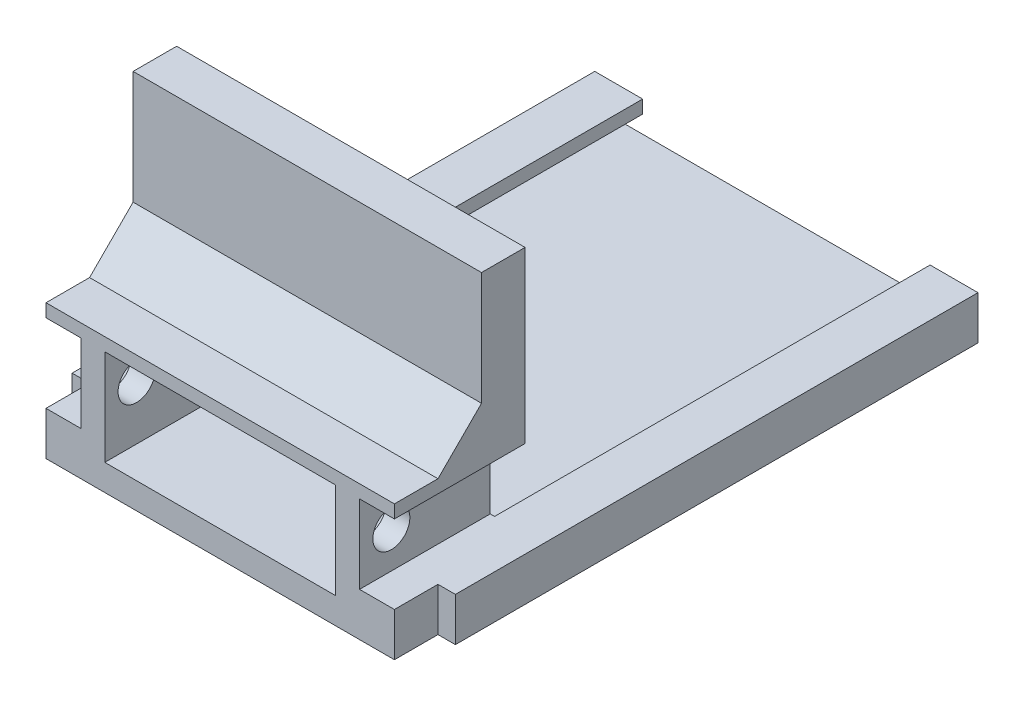
ISO-10303-21;
HEADER;
FILE_DESCRIPTION(('STEP AP214'),'2;1');
FILE_NAME('part.step','',(''),(''),'','','');
FILE_SCHEMA(('AUTOMOTIVE_DESIGN { 1 0 10303 214 1 1 1 1 }'));
ENDSEC;
DATA;
#1=APPLICATION_CONTEXT('core data for automotive mechanical design processes');
#2=APPLICATION_PROTOCOL_DEFINITION('international standard','automotive_design',2000,#1);
#3=PRODUCT_CONTEXT('',#1,'mechanical');
#4=PRODUCT('Part','Part','',(#3));
#5=PRODUCT_RELATED_PRODUCT_CATEGORY('part','',(#4));
#6=PRODUCT_DEFINITION_FORMATION('','',#4);
#7=PRODUCT_DEFINITION_CONTEXT('part definition',#1,'design');
#8=PRODUCT_DEFINITION('design','',#6,#7);
#9=PRODUCT_DEFINITION_SHAPE('','',#8);
#10=(LENGTH_UNIT() NAMED_UNIT(*) SI_UNIT(.MILLI.,.METRE.));
#11=(NAMED_UNIT(*) PLANE_ANGLE_UNIT() SI_UNIT($,.RADIAN.));
#12=(NAMED_UNIT(*) SI_UNIT($,.STERADIAN.) SOLID_ANGLE_UNIT());
#13=UNCERTAINTY_MEASURE_WITH_UNIT(LENGTH_MEASURE(1.E-05),#10,'distance_accuracy_value','');
#14=(GEOMETRIC_REPRESENTATION_CONTEXT(3) GLOBAL_UNCERTAINTY_ASSIGNED_CONTEXT((#13)) GLOBAL_UNIT_ASSIGNED_CONTEXT((#10,
#11,#12)) REPRESENTATION_CONTEXT('',''));
#15=CARTESIAN_POINT('',(0.,0.,0.));
#16=DIRECTION('',(0.,0.,1.));
#17=DIRECTION('',(1.,0.,0.));
#18=AXIS2_PLACEMENT_3D('',#15,#16,#17);
#19=CARTESIAN_POINT('',(3.99999999999999,0.,120.));
#20=DIRECTION('',(-1.,0.,0.));
#21=DIRECTION('',(0.,-1.,0.));
#22=AXIS2_PLACEMENT_3D('',#19,#20,#21);
#23=PLANE('',#22);
#24=DIRECTION('',(0.,-1.,0.));
#25=VECTOR('',#24,1.);
#26=CARTESIAN_POINT('',(3.99999999999999,57.,110.));
#27=LINE('',#26,#25);
#28=CARTESIAN_POINT('',(3.99999999999999,57.,110.));
#29=VERTEX_POINT('',#28);
#30=CARTESIAN_POINT('',(3.99999999999999,31.,110.));
#31=VERTEX_POINT('',#30);
#32=EDGE_CURVE('E246',#29,#31,#27,.T.);
#33=ORIENTED_EDGE('',*,*,#32,.F.);
#34=DIRECTION('',(0.,0.,-1.));
#35=VECTOR('',#34,1.);
#36=CARTESIAN_POINT('',(3.99999999999999,57.,120.));
#37=LINE('',#36,#35);
#38=CARTESIAN_POINT('',(3.99999999999999,57.,100.));
#39=VERTEX_POINT('',#38);
#40=EDGE_CURVE('E254',#29,#39,#37,.T.);
#41=ORIENTED_EDGE('',*,*,#40,.T.);
#42=DIRECTION('',(0.,1.,0.));
#43=VECTOR('',#42,1.);
#44=CARTESIAN_POINT('',(3.99999999999999,0.,100.));
#45=LINE('',#44,#43);
#46=CARTESIAN_POINT('',(3.99999999999999,18.,100.));
#47=VERTEX_POINT('',#46);
#48=EDGE_CURVE('E474',#47,#39,#45,.T.);
#49=ORIENTED_EDGE('',*,*,#48,.F.);
#50=DIRECTION('',(0.,0.,1.));
#51=VECTOR('',#50,1.);
#52=CARTESIAN_POINT('',(3.99999999999999,18.,42.6153330583857));
#53=LINE('',#52,#51);
#54=CARTESIAN_POINT('',(3.99999999999999,18.,130.));
#55=VERTEX_POINT('',#54);
#56=EDGE_CURVE('E489',#47,#55,#53,.T.);
#57=ORIENTED_EDGE('',*,*,#56,.T.);
#58=DIRECTION('',(0.,-1.,0.));
#59=VECTOR('',#58,1.);
#60=CARTESIAN_POINT('',(3.99999999999999,-10.,130.));
#61=LINE('',#60,#59);
#62=CARTESIAN_POINT('',(3.99999999999999,21.,130.));
#63=VERTEX_POINT('',#62);
#64=EDGE_CURVE('E491',#63,#55,#61,.T.);
#65=ORIENTED_EDGE('',*,*,#64,.F.);
#66=DIRECTION('',(0.,0.,-1.));
#67=VECTOR('',#66,1.);
#68=CARTESIAN_POINT('',(3.99999999999999,21.,130.));
#69=LINE('',#68,#67);
#70=CARTESIAN_POINT('',(3.99999999999999,21.,120.));
#71=VERTEX_POINT('',#70);
#72=EDGE_CURVE('E523',#63,#71,#69,.T.);
#73=ORIENTED_EDGE('',*,*,#72,.T.);
#74=DIRECTION('',(0.,-0.707106781186544,0.707106781186551));
#75=VECTOR('',#74,1.);
#76=CARTESIAN_POINT('',(3.99999999999999,21.,120.));
#77=LINE('',#76,#75);
#78=EDGE_CURVE('E52',#71,#31,#77,.F.);
#79=ORIENTED_EDGE('',*,*,#78,.T.);
#80=EDGE_LOOP('',(#33,#41,#49,#57,#65,#73,#79));
#81=FACE_BOUND('',#80,.T.);
#82=ADVANCED_FACE('F42',(#81),#23,.T.);
#83=CARTESIAN_POINT('',(84.,0.,120.));
#84=DIRECTION('',(-1.,0.,0.));
#85=DIRECTION('',(0.,-1.,0.));
#86=AXIS2_PLACEMENT_3D('',#83,#84,#85);
#87=PLANE('',#86);
#88=DIRECTION('',(0.,1.,0.));
#89=VECTOR('',#88,1.);
#90=CARTESIAN_POINT('',(84.,-10.,120.));
#91=LINE('',#90,#89);
#92=CARTESIAN_POINT('',(84.,-10.,120.));
#93=VERTEX_POINT('',#92);
#94=CARTESIAN_POINT('',(84.,0.,120.));
#95=VERTEX_POINT('',#94);
#96=EDGE_CURVE('E514',#93,#95,#91,.T.);
#97=ORIENTED_EDGE('',*,*,#96,.T.);
#98=DIRECTION('',(0.,0.,1.));
#99=VECTOR('',#98,1.);
#100=CARTESIAN_POINT('',(84.,0.,42.6153330583857));
#101=LINE('',#100,#99);
#102=CARTESIAN_POINT('',(84.,0.,130.));
#103=VERTEX_POINT('',#102);
#104=EDGE_CURVE('E566',#95,#103,#101,.T.);
#105=ORIENTED_EDGE('',*,*,#104,.T.);
#106=DIRECTION('',(0.,1.,0.));
#107=VECTOR('',#106,1.);
#108=CARTESIAN_POINT('',(84.,-10.,130.));
#109=LINE('',#108,#107);
#110=CARTESIAN_POINT('',(84.,-10.,130.));
#111=VERTEX_POINT('',#110);
#112=EDGE_CURVE('E519',#111,#103,#109,.T.);
#113=ORIENTED_EDGE('',*,*,#112,.F.);
#114=DIRECTION('',(0.,0.,-1.));
#115=VECTOR('',#114,1.);
#116=CARTESIAN_POINT('',(84.,-10.,130.));
#117=LINE('',#116,#115);
#118=EDGE_CURVE('E534',#111,#93,#117,.T.);
#119=ORIENTED_EDGE('',*,*,#118,.T.);
#120=EDGE_LOOP('',(#97,#105,#113,#119));
#121=FACE_BOUND('',#120,.T.);
#122=ADVANCED_FACE('F664',(#121),#87,.F.);
#123=CARTESIAN_POINT('',(0.,0.,120.));
#124=DIRECTION('',(0.,0.,1.));
#125=DIRECTION('',(1.,0.,0.));
#126=AXIS2_PLACEMENT_3D('',#123,#124,#125);
#127=PLANE('',#126);
#128=DIRECTION('',(0.,-1.,0.));
#129=VECTOR('',#128,1.);
#130=CARTESIAN_POINT('',(3.99999999999999,-10.,120.));
#131=LINE('',#130,#129);
#132=CARTESIAN_POINT('',(3.99999999999999,0.,120.));
#133=VERTEX_POINT('',#132);
#134=CARTESIAN_POINT('',(3.99999999999999,-10.,120.));
#135=VERTEX_POINT('',#134);
#136=EDGE_CURVE('E378',#133,#135,#131,.T.);
#137=ORIENTED_EDGE('',*,*,#136,.F.);
#138=DIRECTION('',(-1.,0.,0.));
#139=VECTOR('',#138,1.);
#140=CARTESIAN_POINT('',(0.,0.,120.));
#141=LINE('',#140,#139);
#142=CARTESIAN_POINT('',(0.,0.,120.));
#143=VERTEX_POINT('',#142);
#144=EDGE_CURVE('E461',#133,#143,#141,.T.);
#145=ORIENTED_EDGE('',*,*,#144,.T.);
#146=DIRECTION('',(0.,-1.,0.));
#147=VECTOR('',#146,1.);
#148=CARTESIAN_POINT('',(0.,0.,120.));
#149=LINE('',#148,#147);
#150=CARTESIAN_POINT('',(0.,-10.,120.));
#151=VERTEX_POINT('',#150);
#152=EDGE_CURVE('E455',#143,#151,#149,.T.);
#153=ORIENTED_EDGE('',*,*,#152,.T.);
#154=DIRECTION('',(1.,0.,0.));
#155=VECTOR('',#154,1.);
#156=CARTESIAN_POINT('',(0.,-10.,120.));
#157=LINE('',#156,#155);
#158=EDGE_CURVE('E450',#151,#135,#157,.T.);
#159=ORIENTED_EDGE('',*,*,#158,.T.);
#160=EDGE_LOOP('',(#137,#145,#153,#159));
#161=FACE_BOUND('',#160,.T.);
#162=ADVANCED_FACE('F459',(#161),#127,.T.);
#163=CARTESIAN_POINT('',(0.,-3.,100.));
#164=DIRECTION('',(0.,1.,0.));
#165=DIRECTION('',(0.,0.,1.));
#166=AXIS2_PLACEMENT_3D('',#163,#164,#165);
#167=PLANE('',#166);
#168=DIRECTION('',(1.,0.,0.));
#169=VECTOR('',#168,1.);
#170=CARTESIAN_POINT('',(0.,-3.,0.));
#171=LINE('',#170,#169);
#172=CARTESIAN_POINT('',(77.,-3.,0.));
#173=VERTEX_POINT('',#172);
#174=CARTESIAN_POINT('',(85.,-3.,0.));
#175=VERTEX_POINT('',#174);
#176=EDGE_CURVE('E269',#173,#175,#171,.T.);
#177=ORIENTED_EDGE('',*,*,#176,.T.);
#178=DIRECTION('',(0.,0.,-1.));
#179=VECTOR('',#178,1.);
#180=CARTESIAN_POINT('',(85.,-3.,100.));
#181=LINE('',#180,#179);
#182=CARTESIAN_POINT('',(85.,-3.,100.));
#183=VERTEX_POINT('',#182);
#184=EDGE_CURVE('E374',#183,#175,#181,.T.);
#185=ORIENTED_EDGE('',*,*,#184,.F.);
#186=DIRECTION('',(1.,0.,0.));
#187=VECTOR('',#186,1.);
#188=CARTESIAN_POINT('',(0.,-3.,100.));
#189=LINE('',#188,#187);
#190=CARTESIAN_POINT('',(77.,-3.,100.));
#191=VERTEX_POINT('',#190);
#192=EDGE_CURVE('E277',#191,#183,#189,.T.);
#193=ORIENTED_EDGE('',*,*,#192,.F.);
#194=DIRECTION('',(0.,0.,-1.));
#195=VECTOR('',#194,1.);
#196=CARTESIAN_POINT('',(77.,-3.,100.));
#197=LINE('',#196,#195);
#198=EDGE_CURVE('E301',#191,#173,#197,.T.);
#199=ORIENTED_EDGE('',*,*,#198,.T.);
#200=EDGE_LOOP('',(#177,#185,#193,#199));
#201=FACE_BOUND('',#200,.T.);
#202=ADVANCED_FACE('F428',(#201),#167,.F.);
#203=CARTESIAN_POINT('',(85.,0.,100.));
#204=DIRECTION('',(1.,0.,0.));
#205=DIRECTION('',(0.,0.,-1.));
#206=AXIS2_PLACEMENT_3D('',#203,#204,#205);
#207=PLANE('',#206);
#208=DIRECTION('',(0.,-1.,0.));
#209=VECTOR('',#208,1.);
#210=CARTESIAN_POINT('',(85.,0.,0.));
#211=LINE('',#210,#209);
#212=CARTESIAN_POINT('',(85.,-7.,0.));
#213=VERTEX_POINT('',#212);
#214=EDGE_CURVE('E305',#175,#213,#211,.T.);
#215=ORIENTED_EDGE('',*,*,#214,.T.);
#216=DIRECTION('',(0.,0.,-1.));
#217=VECTOR('',#216,1.);
#218=CARTESIAN_POINT('',(85.,-7.,100.));
#219=LINE('',#218,#217);
#220=CARTESIAN_POINT('',(85.,-7.,100.));
#221=VERTEX_POINT('',#220);
#222=EDGE_CURVE('E371',#221,#213,#219,.T.);
#223=ORIENTED_EDGE('',*,*,#222,.F.);
#224=DIRECTION('',(0.,-1.,0.));
#225=VECTOR('',#224,1.);
#226=CARTESIAN_POINT('',(85.,0.,100.));
#227=LINE('',#226,#225);
#228=EDGE_CURVE('E280',#183,#221,#227,.T.);
#229=ORIENTED_EDGE('',*,*,#228,.F.);
#230=ORIENTED_EDGE('',*,*,#184,.T.);
#231=EDGE_LOOP('',(#215,#223,#229,#230));
#232=FACE_BOUND('',#231,.T.);
#233=ADVANCED_FACE('F425',(#232),#207,.F.);
#234=CARTESIAN_POINT('',(0.,-7.,100.));
#235=DIRECTION('',(0.,1.,0.));
#236=DIRECTION('',(0.,0.,1.));
#237=AXIS2_PLACEMENT_3D('',#234,#235,#236);
#238=PLANE('',#237);
#239=DIRECTION('',(1.,0.,0.));
#240=VECTOR('',#239,1.);
#241=CARTESIAN_POINT('',(0.,-7.,0.));
#242=LINE('',#241,#240);
#243=CARTESIAN_POINT('',(3.,-7.,0.));
#244=VERTEX_POINT('',#243);
#245=EDGE_CURVE('E310',#244,#213,#242,.T.);
#246=ORIENTED_EDGE('',*,*,#245,.F.);
#247=DIRECTION('',(0.,0.,-1.));
#248=VECTOR('',#247,1.);
#249=CARTESIAN_POINT('',(3.,-7.,100.));
#250=LINE('',#249,#248);
#251=CARTESIAN_POINT('',(3.,-7.,100.));
#252=VERTEX_POINT('',#251);
#253=EDGE_CURVE('E368',#252,#244,#250,.T.);
#254=ORIENTED_EDGE('',*,*,#253,.F.);
#255=DIRECTION('',(1.,0.,0.));
#256=VECTOR('',#255,1.);
#257=CARTESIAN_POINT('',(0.,-7.,100.));
#258=LINE('',#257,#256);
#259=EDGE_CURVE('E286',#252,#221,#258,.T.);
#260=ORIENTED_EDGE('',*,*,#259,.T.);
#261=ORIENTED_EDGE('',*,*,#222,.T.);
#262=EDGE_LOOP('',(#246,#254,#260,#261));
#263=FACE_BOUND('',#262,.T.);
#264=ADVANCED_FACE('F421',(#263),#238,.T.);
#265=CARTESIAN_POINT('',(3.,0.,100.));
#266=DIRECTION('',(1.,0.,0.));
#267=DIRECTION('',(0.,1.,0.));
#268=AXIS2_PLACEMENT_3D('',#265,#266,#267);
#269=PLANE('',#268);
#270=DIRECTION('',(0.,-1.,0.));
#271=VECTOR('',#270,1.);
#272=CARTESIAN_POINT('',(3.,0.,0.));
#273=LINE('',#272,#271);
#274=CARTESIAN_POINT('',(3.,-3.,0.));
#275=VERTEX_POINT('',#274);
#276=EDGE_CURVE('E314',#275,#244,#273,.T.);
#277=ORIENTED_EDGE('',*,*,#276,.F.);
#278=DIRECTION('',(0.,0.,-1.));
#279=VECTOR('',#278,1.);
#280=CARTESIAN_POINT('',(3.,-3.,100.));
#281=LINE('',#280,#279);
#282=CARTESIAN_POINT('',(3.,-3.,100.));
#283=VERTEX_POINT('',#282);
#284=EDGE_CURVE('E365',#283,#275,#281,.T.);
#285=ORIENTED_EDGE('',*,*,#284,.F.);
#286=DIRECTION('',(0.,-1.,0.));
#287=VECTOR('',#286,1.);
#288=CARTESIAN_POINT('',(3.,0.,100.));
#289=LINE('',#288,#287);
#290=EDGE_CURVE('E289',#283,#252,#289,.T.);
#291=ORIENTED_EDGE('',*,*,#290,.T.);
#292=ORIENTED_EDGE('',*,*,#253,.T.);
#293=EDGE_LOOP('',(#277,#285,#291,#292));
#294=FACE_BOUND('',#293,.T.);
#295=ADVANCED_FACE('F418',(#294),#269,.T.);
#296=CARTESIAN_POINT('',(11.,-3.,0.));
#297=VERTEX_POINT('',#296);
#298=EDGE_CURVE('E306',#275,#297,#171,.T.);
#299=ORIENTED_EDGE('',*,*,#298,.T.);
#300=DIRECTION('',(0.,0.,-1.));
#301=VECTOR('',#300,1.);
#302=CARTESIAN_POINT('',(11.,-3.,100.));
#303=LINE('',#302,#301);
#304=CARTESIAN_POINT('',(11.,-3.,100.));
#305=VERTEX_POINT('',#304);
#306=EDGE_CURVE('E362',#305,#297,#303,.T.);
#307=ORIENTED_EDGE('',*,*,#306,.F.);
#308=EDGE_CURVE('E282',#283,#305,#189,.T.);
#309=ORIENTED_EDGE('',*,*,#308,.F.);
#310=ORIENTED_EDGE('',*,*,#284,.T.);
#311=EDGE_LOOP('',(#299,#307,#309,#310));
#312=FACE_BOUND('',#311,.T.);
#313=ADVANCED_FACE('F396',(#312),#167,.F.);
#314=CARTESIAN_POINT('',(11.,0.,100.));
#315=DIRECTION('',(1.,0.,0.));
#316=DIRECTION('',(0.,0.,-1.));
#317=AXIS2_PLACEMENT_3D('',#314,#315,#316);
#318=PLANE('',#317);
#319=DIRECTION('',(0.,-1.,0.));
#320=VECTOR('',#319,1.);
#321=CARTESIAN_POINT('',(11.,0.,0.));
#322=LINE('',#321,#320);
#323=CARTESIAN_POINT('',(11.,0.,0.));
#324=VERTEX_POINT('',#323);
#325=EDGE_CURVE('E318',#324,#297,#322,.T.);
#326=ORIENTED_EDGE('',*,*,#325,.F.);
#327=DIRECTION('',(0.,0.,-1.));
#328=VECTOR('',#327,1.);
#329=CARTESIAN_POINT('',(11.,0.,100.));
#330=LINE('',#329,#328);
#331=CARTESIAN_POINT('',(11.,0.,100.));
#332=VERTEX_POINT('',#331);
#333=EDGE_CURVE('E359',#332,#324,#330,.T.);
#334=ORIENTED_EDGE('',*,*,#333,.F.);
#335=DIRECTION('',(0.,-1.,0.));
#336=VECTOR('',#335,1.);
#337=CARTESIAN_POINT('',(11.,0.,100.));
#338=LINE('',#337,#336);
#339=EDGE_CURVE('E293',#332,#305,#338,.T.);
#340=ORIENTED_EDGE('',*,*,#339,.T.);
#341=ORIENTED_EDGE('',*,*,#306,.T.);
#342=EDGE_LOOP('',(#326,#334,#340,#341));
#343=FACE_BOUND('',#342,.T.);
#344=ADVANCED_FACE('F407',(#343),#318,.T.);
#345=CARTESIAN_POINT('',(0.,0.,100.));
#346=DIRECTION('',(0.,1.,0.));
#347=DIRECTION('',(0.,0.,1.));
#348=AXIS2_PLACEMENT_3D('',#345,#346,#347);
#349=PLANE('',#348);
#350=DIRECTION('',(1.,0.,0.));
#351=VECTOR('',#350,1.);
#352=CARTESIAN_POINT('',(0.,0.,0.));
#353=LINE('',#352,#351);
#354=CARTESIAN_POINT('',(0.,0.,0.));
#355=VERTEX_POINT('',#354);
#356=EDGE_CURVE('E322',#355,#324,#353,.T.);
#357=ORIENTED_EDGE('',*,*,#356,.F.);
#358=DIRECTION('',(0.,0.,-1.));
#359=VECTOR('',#358,1.);
#360=CARTESIAN_POINT('',(0.,0.,100.));
#361=LINE('',#360,#359);
#362=EDGE_CURVE('E356',#143,#355,#361,.T.);
#363=ORIENTED_EDGE('',*,*,#362,.F.);
#364=ORIENTED_EDGE('',*,*,#144,.F.);
#365=DIRECTION('',(0.,0.,1.));
#366=VECTOR('',#365,1.);
#367=CARTESIAN_POINT('',(3.99999999999999,0.,42.6153330583857));
#368=LINE('',#367,#366);
#369=CARTESIAN_POINT('',(3.99999999999999,0.,130.));
#370=VERTEX_POINT('',#369);
#371=EDGE_CURVE('E544',#133,#370,#368,.T.);
#372=ORIENTED_EDGE('',*,*,#371,.T.);
#373=DIRECTION('',(1.,0.,0.));
#374=VECTOR('',#373,1.);
#375=CARTESIAN_POINT('',(3.99999999999999,0.,130.));
#376=LINE('',#375,#374);
#377=CARTESIAN_POINT('',(12.,0.,130.));
#378=VERTEX_POINT('',#377);
#379=EDGE_CURVE('E595',#370,#378,#376,.T.);
#380=ORIENTED_EDGE('',*,*,#379,.T.);
#381=DIRECTION('',(0.,0.,1.));
#382=VECTOR('',#381,1.);
#383=CARTESIAN_POINT('',(12.,0.,42.6153330583857));
#384=LINE('',#383,#382);
#385=CARTESIAN_POINT('',(12.,0.,100.));
#386=VERTEX_POINT('',#385);
#387=EDGE_CURVE('E550',#386,#378,#384,.T.);
#388=ORIENTED_EDGE('',*,*,#387,.F.);
#389=DIRECTION('',(-1.,0.,0.));
#390=VECTOR('',#389,1.);
#391=CARTESIAN_POINT('',(3.99999999999999,0.,100.));
#392=LINE('',#391,#390);
#393=EDGE_CURVE('E414',#386,#332,#392,.T.);
#394=ORIENTED_EDGE('',*,*,#393,.T.);
#395=ORIENTED_EDGE('',*,*,#333,.T.);
#396=EDGE_LOOP('',(#357,#363,#364,#372,#380,#388,#394,#395));
#397=FACE_BOUND('',#396,.T.);
#398=ADVANCED_FACE('F546',(#397),#349,.T.);
#399=CARTESIAN_POINT('',(0.,0.,100.));
#400=DIRECTION('',(1.,0.,0.));
#401=DIRECTION('',(0.,0.,-1.));
#402=AXIS2_PLACEMENT_3D('',#399,#400,#401);
#403=PLANE('',#402);
#404=DIRECTION('',(0.,-1.,0.));
#405=VECTOR('',#404,1.);
#406=CARTESIAN_POINT('',(0.,0.,0.));
#407=LINE('',#406,#405);
#408=CARTESIAN_POINT('',(0.,-10.,0.));
#409=VERTEX_POINT('',#408);
#410=EDGE_CURVE('E326',#355,#409,#407,.T.);
#411=ORIENTED_EDGE('',*,*,#410,.T.);
#412=DIRECTION('',(0.,0.,-1.));
#413=VECTOR('',#412,1.);
#414=CARTESIAN_POINT('',(0.,-10.,100.));
#415=LINE('',#414,#413);
#416=EDGE_CURVE('E352',#151,#409,#415,.T.);
#417=ORIENTED_EDGE('',*,*,#416,.F.);
#418=ORIENTED_EDGE('',*,*,#152,.F.);
#419=ORIENTED_EDGE('',*,*,#362,.T.);
#420=EDGE_LOOP('',(#411,#417,#418,#419));
#421=FACE_BOUND('',#420,.T.);
#422=ADVANCED_FACE('F454',(#421),#403,.F.);
#423=CARTESIAN_POINT('',(0.,-10.,100.));
#424=DIRECTION('',(0.,1.,0.));
#425=DIRECTION('',(0.,0.,1.));
#426=AXIS2_PLACEMENT_3D('',#423,#424,#425);
#427=PLANE('',#426);
#428=DIRECTION('',(0.,0.,-1.));
#429=VECTOR('',#428,1.);
#430=CARTESIAN_POINT('',(3.99999999999999,-10.,130.));
#431=LINE('',#430,#429);
#432=CARTESIAN_POINT('',(3.99999999999999,-10.,130.));
#433=VERTEX_POINT('',#432);
#434=EDGE_CURVE('E477',#433,#135,#431,.T.);
#435=ORIENTED_EDGE('',*,*,#434,.T.);
#436=ORIENTED_EDGE('',*,*,#158,.F.);
#437=ORIENTED_EDGE('',*,*,#416,.T.);
#438=DIRECTION('',(1.,0.,0.));
#439=VECTOR('',#438,1.);
#440=CARTESIAN_POINT('',(0.,-10.,0.));
#441=LINE('',#440,#439);
#442=CARTESIAN_POINT('',(88.,-10.,0.));
#443=VERTEX_POINT('',#442);
#444=EDGE_CURVE('E330',#409,#443,#441,.T.);
#445=ORIENTED_EDGE('',*,*,#444,.T.);
#446=DIRECTION('',(0.,0.,-1.));
#447=VECTOR('',#446,1.);
#448=CARTESIAN_POINT('',(88.,-10.,100.));
#449=LINE('',#448,#447);
#450=CARTESIAN_POINT('',(88.,-10.,120.));
#451=VERTEX_POINT('',#450);
#452=EDGE_CURVE('E349',#451,#443,#449,.T.);
#453=ORIENTED_EDGE('',*,*,#452,.F.);
#454=EDGE_CURVE('E463',#93,#451,#157,.T.);
#455=ORIENTED_EDGE('',*,*,#454,.F.);
#456=ORIENTED_EDGE('',*,*,#118,.F.);
#457=DIRECTION('',(1.,0.,0.));
#458=VECTOR('',#457,1.);
#459=CARTESIAN_POINT('',(3.99999999999999,-10.,130.));
#460=LINE('',#459,#458);
#461=EDGE_CURVE('E507',#433,#111,#460,.T.);
#462=ORIENTED_EDGE('',*,*,#461,.F.);
#463=EDGE_LOOP('',(#435,#436,#437,#445,#453,#455,#456,#462));
#464=FACE_BOUND('',#463,.T.);
#465=ADVANCED_FACE('F447',(#464),#427,.F.);
#466=CARTESIAN_POINT('',(88.,0.,100.));
#467=DIRECTION('',(1.,0.,0.));
#468=DIRECTION('',(0.,0.,-1.));
#469=AXIS2_PLACEMENT_3D('',#466,#467,#468);
#470=PLANE('',#469);
#471=DIRECTION('',(0.,-1.,0.));
#472=VECTOR('',#471,1.);
#473=CARTESIAN_POINT('',(88.,0.,0.));
#474=LINE('',#473,#472);
#475=CARTESIAN_POINT('',(88.,0.,0.));
#476=VERTEX_POINT('',#475);
#477=EDGE_CURVE('E334',#476,#443,#474,.T.);
#478=ORIENTED_EDGE('',*,*,#477,.F.);
#479=DIRECTION('',(0.,0.,-1.));
#480=VECTOR('',#479,1.);
#481=CARTESIAN_POINT('',(88.,0.,100.));
#482=LINE('',#481,#480);
#483=CARTESIAN_POINT('',(88.,0.,120.));
#484=VERTEX_POINT('',#483);
#485=EDGE_CURVE('E346',#484,#476,#482,.T.);
#486=ORIENTED_EDGE('',*,*,#485,.F.);
#487=DIRECTION('',(0.,1.,0.));
#488=VECTOR('',#487,1.);
#489=CARTESIAN_POINT('',(88.,0.,120.));
#490=LINE('',#489,#488);
#491=EDGE_CURVE('E272',#451,#484,#490,.T.);
#492=ORIENTED_EDGE('',*,*,#491,.F.);
#493=ORIENTED_EDGE('',*,*,#452,.T.);
#494=EDGE_LOOP('',(#478,#486,#492,#493));
#495=FACE_BOUND('',#494,.T.);
#496=ADVANCED_FACE('F442',(#495),#470,.T.);
#497=CARTESIAN_POINT('',(77.,0.,0.));
#498=VERTEX_POINT('',#497);
#499=EDGE_CURVE('E327',#498,#476,#353,.T.);
#500=ORIENTED_EDGE('',*,*,#499,.F.);
#501=DIRECTION('',(0.,0.,-1.));
#502=VECTOR('',#501,1.);
#503=CARTESIAN_POINT('',(77.,0.,100.));
#504=LINE('',#503,#502);
#505=CARTESIAN_POINT('',(77.,0.,100.));
#506=VERTEX_POINT('',#505);
#507=EDGE_CURVE('E343',#506,#498,#504,.T.);
#508=ORIENTED_EDGE('',*,*,#507,.F.);
#509=DIRECTION('',(-1.,0.,0.));
#510=VECTOR('',#509,1.);
#511=CARTESIAN_POINT('',(84.,0.,100.));
#512=LINE('',#511,#510);
#513=CARTESIAN_POINT('',(76.,0.,100.));
#514=VERTEX_POINT('',#513);
#515=EDGE_CURVE('E565',#506,#514,#512,.T.);
#516=ORIENTED_EDGE('',*,*,#515,.T.);
#517=DIRECTION('',(0.,0.,1.));
#518=VECTOR('',#517,1.);
#519=CARTESIAN_POINT('',(76.,0.,42.6153330583857));
#520=LINE('',#519,#518);
#521=CARTESIAN_POINT('',(76.,0.,130.));
#522=VERTEX_POINT('',#521);
#523=EDGE_CURVE('E585',#514,#522,#520,.T.);
#524=ORIENTED_EDGE('',*,*,#523,.T.);
#525=DIRECTION('',(1.,0.,0.));
#526=VECTOR('',#525,1.);
#527=CARTESIAN_POINT('',(84.,0.,130.));
#528=LINE('',#527,#526);
#529=EDGE_CURVE('E578',#522,#103,#528,.T.);
#530=ORIENTED_EDGE('',*,*,#529,.T.);
#531=ORIENTED_EDGE('',*,*,#104,.F.);
#532=DIRECTION('',(-1.,0.,0.));
#533=VECTOR('',#532,1.);
#534=CARTESIAN_POINT('',(0.,0.,120.));
#535=LINE('',#534,#533);
#536=EDGE_CURVE('E265',#484,#95,#535,.T.);
#537=ORIENTED_EDGE('',*,*,#536,.F.);
#538=ORIENTED_EDGE('',*,*,#485,.T.);
#539=EDGE_LOOP('',(#500,#508,#516,#524,#530,#531,#537,#538));
#540=FACE_BOUND('',#539,.T.);
#541=ADVANCED_FACE('F435',(#540),#349,.T.);
#542=CARTESIAN_POINT('',(77.,-3.56196553733904E-13,100.));
#543=DIRECTION('',(1.,0.,0.));
#544=DIRECTION('',(0.,1.,0.));
#545=AXIS2_PLACEMENT_3D('',#542,#543,#544);
#546=PLANE('',#545);
#547=DIRECTION('',(0.,-1.,0.));
#548=VECTOR('',#547,1.);
#549=CARTESIAN_POINT('',(77.,-3.56196553733904E-13,0.));
#550=LINE('',#549,#548);
#551=EDGE_CURVE('E281',#498,#173,#550,.T.);
#552=ORIENTED_EDGE('',*,*,#551,.T.);
#553=ORIENTED_EDGE('',*,*,#198,.F.);
#554=DIRECTION('',(0.,-1.,0.));
#555=VECTOR('',#554,1.);
#556=CARTESIAN_POINT('',(77.,-3.56196553733904E-13,100.));
#557=LINE('',#556,#555);
#558=EDGE_CURVE('E297',#506,#191,#557,.T.);
#559=ORIENTED_EDGE('',*,*,#558,.F.);
#560=ORIENTED_EDGE('',*,*,#507,.T.);
#561=EDGE_LOOP('',(#552,#553,#559,#560));
#562=FACE_BOUND('',#561,.T.);
#563=ADVANCED_FACE('F681',(#562),#546,.F.);
#564=CARTESIAN_POINT('',(0.,0.,0.));
#565=DIRECTION('',(0.,0.,1.));
#566=DIRECTION('',(1.,0.,0.));
#567=AXIS2_PLACEMENT_3D('',#564,#565,#566);
#568=PLANE('',#567);
#569=ORIENTED_EDGE('',*,*,#176,.F.);
#570=ORIENTED_EDGE('',*,*,#551,.F.);
#571=ORIENTED_EDGE('',*,*,#499,.T.);
#572=ORIENTED_EDGE('',*,*,#477,.T.);
#573=ORIENTED_EDGE('',*,*,#444,.F.);
#574=ORIENTED_EDGE('',*,*,#410,.F.);
#575=ORIENTED_EDGE('',*,*,#356,.T.);
#576=ORIENTED_EDGE('',*,*,#325,.T.);
#577=ORIENTED_EDGE('',*,*,#298,.F.);
#578=ORIENTED_EDGE('',*,*,#276,.T.);
#579=ORIENTED_EDGE('',*,*,#245,.T.);
#580=ORIENTED_EDGE('',*,*,#214,.F.);
#581=EDGE_LOOP('',(#569,#570,#571,#572,#573,#574,#575,#576,#577,#578,#579,#580));
#582=FACE_BOUND('',#581,.T.);
#583=ADVANCED_FACE('F402',(#582),#568,.F.);
#584=ORIENTED_EDGE('',*,*,#371,.F.);
#585=ORIENTED_EDGE('',*,*,#136,.T.);
#586=ORIENTED_EDGE('',*,*,#434,.F.);
#587=EDGE_CURVE('E508',#370,#433,#61,.T.);
#588=ORIENTED_EDGE('',*,*,#587,.F.);
#589=EDGE_LOOP('',(#584,#585,#586,#588));
#590=FACE_BOUND('',#589,.T.);
#591=ADVANCED_FACE('F543',(#590),#23,.T.);
#592=DIRECTION('',(0.,0.,-1.));
#593=VECTOR('',#592,1.);
#594=CARTESIAN_POINT('',(84.,57.,120.));
#595=LINE('',#594,#593);
#596=CARTESIAN_POINT('',(84.,57.,110.));
#597=VERTEX_POINT('',#596);
#598=CARTESIAN_POINT('',(84.,57.,100.));
#599=VERTEX_POINT('',#598);
#600=EDGE_CURVE('E264',#597,#599,#595,.T.);
#601=ORIENTED_EDGE('',*,*,#600,.F.);
#602=DIRECTION('',(0.,1.,0.));
#603=VECTOR('',#602,1.);
#604=CARTESIAN_POINT('',(84.,57.,110.));
#605=LINE('',#604,#603);
#606=CARTESIAN_POINT('',(84.,31.,110.));
#607=VERTEX_POINT('',#606);
#608=EDGE_CURVE('E247',#607,#597,#605,.T.);
#609=ORIENTED_EDGE('',*,*,#608,.F.);
#610=DIRECTION('',(0.,0.707106781186544,-0.707106781186551));
#611=VECTOR('',#610,1.);
#612=CARTESIAN_POINT('',(84.,10.5000000000002,130.5));
#613=LINE('',#612,#611);
#614=CARTESIAN_POINT('',(84.,21.,120.));
#615=VERTEX_POINT('',#614);
#616=EDGE_CURVE('E11',#607,#615,#613,.F.);
#617=ORIENTED_EDGE('',*,*,#616,.T.);
#618=DIRECTION('',(0.,0.,-1.));
#619=VECTOR('',#618,1.);
#620=CARTESIAN_POINT('',(84.,21.,130.));
#621=LINE('',#620,#619);
#622=CARTESIAN_POINT('',(84.,21.,130.));
#623=VERTEX_POINT('',#622);
#624=EDGE_CURVE('E530',#623,#615,#621,.T.);
#625=ORIENTED_EDGE('',*,*,#624,.F.);
#626=CARTESIAN_POINT('',(84.,18.,130.));
#627=VERTEX_POINT('',#626);
#628=EDGE_CURVE('E512',#627,#623,#109,.T.);
#629=ORIENTED_EDGE('',*,*,#628,.F.);
#630=DIRECTION('',(0.,0.,1.));
#631=VECTOR('',#630,1.);
#632=CARTESIAN_POINT('',(84.,18.,42.6153330583857));
#633=LINE('',#632,#631);
#634=CARTESIAN_POINT('',(84.,18.,100.));
#635=VERTEX_POINT('',#634);
#636=EDGE_CURVE('E581',#635,#627,#633,.T.);
#637=ORIENTED_EDGE('',*,*,#636,.F.);
#638=DIRECTION('',(0.,1.,0.));
#639=VECTOR('',#638,1.);
#640=CARTESIAN_POINT('',(84.,0.,100.));
#641=LINE('',#640,#639);
#642=EDGE_CURVE('E476',#635,#599,#641,.T.);
#643=ORIENTED_EDGE('',*,*,#642,.T.);
#644=EDGE_LOOP('',(#601,#609,#617,#625,#629,#637,#643));
#645=FACE_BOUND('',#644,.T.);
#646=ADVANCED_FACE('F673',(#645),#87,.F.);
#647=CARTESIAN_POINT('',(0.,57.,120.));
#648=DIRECTION('',(0.,1.,0.));
#649=DIRECTION('',(-1.,0.,0.));
#650=AXIS2_PLACEMENT_3D('',#647,#648,#649);
#651=PLANE('',#650);
#652=DIRECTION('',(-1.,0.,0.));
#653=VECTOR('',#652,1.);
#654=CARTESIAN_POINT('',(121.363083384539,57.,110.));
#655=LINE('',#654,#653);
#656=EDGE_CURVE('E244',#597,#29,#655,.T.);
#657=ORIENTED_EDGE('',*,*,#656,.F.);
#658=ORIENTED_EDGE('',*,*,#600,.T.);
#659=DIRECTION('',(1.,0.,0.));
#660=VECTOR('',#659,1.);
#661=CARTESIAN_POINT('',(0.,57.,100.));
#662=LINE('',#661,#660);
#663=EDGE_CURVE('E262',#39,#599,#662,.T.);
#664=ORIENTED_EDGE('',*,*,#663,.F.);
#665=ORIENTED_EDGE('',*,*,#40,.F.);
#666=EDGE_LOOP('',(#657,#658,#664,#665));
#667=FACE_BOUND('',#666,.T.);
#668=ADVANCED_FACE('F260',(#667),#651,.T.);
#669=ORIENTED_EDGE('',*,*,#96,.F.);
#670=ORIENTED_EDGE('',*,*,#454,.T.);
#671=ORIENTED_EDGE('',*,*,#491,.T.);
#672=ORIENTED_EDGE('',*,*,#536,.T.);
#673=EDGE_LOOP('',(#669,#670,#671,#672));
#674=FACE_BOUND('',#673,.T.);
#675=ADVANCED_FACE('F713',(#674),#127,.T.);
#676=CARTESIAN_POINT('',(0.,0.,100.));
#677=DIRECTION('',(0.,0.,1.));
#678=DIRECTION('',(1.,0.,0.));
#679=AXIS2_PLACEMENT_3D('',#676,#677,#678);
#680=PLANE('',#679);
#681=DIRECTION('',(1.,0.,0.));
#682=VECTOR('',#681,1.);
#683=CARTESIAN_POINT('',(17.5,18.,100.));
#684=LINE('',#683,#682);
#685=CARTESIAN_POINT('',(17.5,18.,100.));
#686=VERTEX_POINT('',#685);
#687=CARTESIAN_POINT('',(70.5,18.,100.));
#688=VERTEX_POINT('',#687);
#689=EDGE_CURVE('E600',#686,#688,#684,.T.);
#690=ORIENTED_EDGE('',*,*,#689,.F.);
#691=DIRECTION('',(0.,1.,0.));
#692=VECTOR('',#691,1.);
#693=CARTESIAN_POINT('',(17.5,18.,100.));
#694=LINE('',#693,#692);
#695=CARTESIAN_POINT('',(17.5,-4.,100.));
#696=VERTEX_POINT('',#695);
#697=EDGE_CURVE('E604',#696,#686,#694,.T.);
#698=ORIENTED_EDGE('',*,*,#697,.F.);
#699=DIRECTION('',(-1.,0.,0.));
#700=VECTOR('',#699,1.);
#701=CARTESIAN_POINT('',(17.5,-4.,100.));
#702=LINE('',#701,#700);
#703=CARTESIAN_POINT('',(70.5,-3.99999999999999,100.));
#704=VERTEX_POINT('',#703);
#705=EDGE_CURVE('E516',#704,#696,#702,.T.);
#706=ORIENTED_EDGE('',*,*,#705,.F.);
#707=DIRECTION('',(0.,-1.,0.));
#708=VECTOR('',#707,1.);
#709=CARTESIAN_POINT('',(70.5,18.,100.));
#710=LINE('',#709,#708);
#711=EDGE_CURVE('E596',#688,#704,#710,.T.);
#712=ORIENTED_EDGE('',*,*,#711,.F.);
#713=EDGE_LOOP('',(#690,#698,#706,#712));
#714=FACE_BOUND('',#713,.T.);
#715=DIRECTION('',(0.,1.,0.));
#716=VECTOR('',#715,1.);
#717=CARTESIAN_POINT('',(76.,18.,100.));
#718=LINE('',#717,#716);
#719=CARTESIAN_POINT('',(76.,18.,100.));
#720=VERTEX_POINT('',#719);
#721=EDGE_CURVE('E562',#514,#720,#718,.T.);
#722=ORIENTED_EDGE('',*,*,#721,.F.);
#723=ORIENTED_EDGE('',*,*,#515,.F.);
#724=ORIENTED_EDGE('',*,*,#558,.T.);
#725=ORIENTED_EDGE('',*,*,#192,.T.);
#726=ORIENTED_EDGE('',*,*,#228,.T.);
#727=ORIENTED_EDGE('',*,*,#259,.F.);
#728=ORIENTED_EDGE('',*,*,#290,.F.);
#729=ORIENTED_EDGE('',*,*,#308,.T.);
#730=ORIENTED_EDGE('',*,*,#339,.F.);
#731=ORIENTED_EDGE('',*,*,#393,.F.);
#732=DIRECTION('',(0.,-1.,0.));
#733=VECTOR('',#732,1.);
#734=CARTESIAN_POINT('',(12.,18.,100.));
#735=LINE('',#734,#733);
#736=CARTESIAN_POINT('',(12.,18.,100.));
#737=VERTEX_POINT('',#736);
#738=EDGE_CURVE('E494',#737,#386,#735,.T.);
#739=ORIENTED_EDGE('',*,*,#738,.F.);
#740=DIRECTION('',(1.,0.,0.));
#741=VECTOR('',#740,1.);
#742=CARTESIAN_POINT('',(3.99999999999999,18.,100.));
#743=LINE('',#742,#741);
#744=EDGE_CURVE('E486',#47,#737,#743,.T.);
#745=ORIENTED_EDGE('',*,*,#744,.F.);
#746=ORIENTED_EDGE('',*,*,#48,.T.);
#747=ORIENTED_EDGE('',*,*,#663,.T.);
#748=ORIENTED_EDGE('',*,*,#642,.F.);
#749=DIRECTION('',(1.,0.,0.));
#750=VECTOR('',#749,1.);
#751=CARTESIAN_POINT('',(84.,18.,100.));
#752=LINE('',#751,#750);
#753=EDGE_CURVE('E569',#720,#635,#752,.T.);
#754=ORIENTED_EDGE('',*,*,#753,.F.);
#755=EDGE_LOOP('',(#722,#723,#724,#725,#726,#727,#728,#729,#730,#731,#739,#745,#746,#747,#748,#754));
#756=FACE_BOUND('',#755,.T.);
#757=ADVANCED_FACE('F412',(#714,#756),#680,.F.);
#758=CARTESIAN_POINT('',(3.99999999999999,21.,130.));
#759=DIRECTION('',(0.,-1.,0.));
#760=DIRECTION('',(0.,0.,-1.));
#761=AXIS2_PLACEMENT_3D('',#758,#759,#760);
#762=PLANE('',#761);
#763=ORIENTED_EDGE('',*,*,#624,.T.);
#764=DIRECTION('',(-1.,0.,0.));
#765=VECTOR('',#764,1.);
#766=CARTESIAN_POINT('',(3.99999999999999,21.,120.));
#767=LINE('',#766,#765);
#768=EDGE_CURVE('E379',#615,#71,#767,.T.);
#769=ORIENTED_EDGE('',*,*,#768,.T.);
#770=ORIENTED_EDGE('',*,*,#72,.F.);
#771=DIRECTION('',(-1.,0.,0.));
#772=VECTOR('',#771,1.);
#773=CARTESIAN_POINT('',(3.99999999999999,21.,130.));
#774=LINE('',#773,#772);
#775=EDGE_CURVE('E504',#623,#63,#774,.T.);
#776=ORIENTED_EDGE('',*,*,#775,.F.);
#777=EDGE_LOOP('',(#763,#769,#770,#776));
#778=FACE_BOUND('',#777,.T.);
#779=ADVANCED_FACE('F722',(#778),#762,.F.);
#780=CARTESIAN_POINT('',(0.,0.,130.));
#781=DIRECTION('',(0.,0.,-1.));
#782=DIRECTION('',(-1.,0.,0.));
#783=AXIS2_PLACEMENT_3D('',#780,#781,#782);
#784=PLANE('',#783);
#785=DIRECTION('',(1.,0.,0.));
#786=VECTOR('',#785,1.);
#787=CARTESIAN_POINT('',(17.5,-4.,130.));
#788=LINE('',#787,#786);
#789=CARTESIAN_POINT('',(17.5,-4.,130.));
#790=VERTEX_POINT('',#789);
#791=CARTESIAN_POINT('',(70.5,-3.99999999999999,130.));
#792=VERTEX_POINT('',#791);
#793=EDGE_CURVE('E556',#790,#792,#788,.T.);
#794=ORIENTED_EDGE('',*,*,#793,.F.);
#795=DIRECTION('',(0.,-1.,0.));
#796=VECTOR('',#795,1.);
#797=CARTESIAN_POINT('',(17.5,18.,130.));
#798=LINE('',#797,#796);
#799=CARTESIAN_POINT('',(17.5,18.,130.));
#800=VERTEX_POINT('',#799);
#801=EDGE_CURVE('E552',#800,#790,#798,.T.);
#802=ORIENTED_EDGE('',*,*,#801,.F.);
#803=DIRECTION('',(-1.,0.,0.));
#804=VECTOR('',#803,1.);
#805=CARTESIAN_POINT('',(17.5,18.,130.));
#806=LINE('',#805,#804);
#807=CARTESIAN_POINT('',(70.5,18.,130.));
#808=VERTEX_POINT('',#807);
#809=EDGE_CURVE('E614',#808,#800,#806,.T.);
#810=ORIENTED_EDGE('',*,*,#809,.F.);
#811=DIRECTION('',(0.,1.,0.));
#812=VECTOR('',#811,1.);
#813=CARTESIAN_POINT('',(70.5,18.,130.));
#814=LINE('',#813,#812);
#815=EDGE_CURVE('E610',#792,#808,#814,.T.);
#816=ORIENTED_EDGE('',*,*,#815,.F.);
#817=EDGE_LOOP('',(#794,#802,#810,#816));
#818=FACE_BOUND('',#817,.T.);
#819=ORIENTED_EDGE('',*,*,#112,.T.);
#820=ORIENTED_EDGE('',*,*,#529,.F.);
#821=DIRECTION('',(0.,-1.,0.));
#822=VECTOR('',#821,1.);
#823=CARTESIAN_POINT('',(76.,18.,130.));
#824=LINE('',#823,#822);
#825=CARTESIAN_POINT('',(76.,18.,130.));
#826=VERTEX_POINT('',#825);
#827=EDGE_CURVE('E574',#826,#522,#824,.T.);
#828=ORIENTED_EDGE('',*,*,#827,.F.);
#829=DIRECTION('',(-1.,0.,0.));
#830=VECTOR('',#829,1.);
#831=CARTESIAN_POINT('',(84.,18.,130.));
#832=LINE('',#831,#830);
#833=EDGE_CURVE('E570',#627,#826,#832,.T.);
#834=ORIENTED_EDGE('',*,*,#833,.F.);
#835=ORIENTED_EDGE('',*,*,#628,.T.);
#836=ORIENTED_EDGE('',*,*,#775,.T.);
#837=ORIENTED_EDGE('',*,*,#64,.T.);
#838=DIRECTION('',(-1.,0.,0.));
#839=VECTOR('',#838,1.);
#840=CARTESIAN_POINT('',(3.99999999999999,18.,130.));
#841=LINE('',#840,#839);
#842=CARTESIAN_POINT('',(12.,18.,130.));
#843=VERTEX_POINT('',#842);
#844=EDGE_CURVE('E502',#843,#55,#841,.T.);
#845=ORIENTED_EDGE('',*,*,#844,.F.);
#846=DIRECTION('',(0.,1.,0.));
#847=VECTOR('',#846,1.);
#848=CARTESIAN_POINT('',(12.,18.,130.));
#849=LINE('',#848,#847);
#850=EDGE_CURVE('E729',#378,#843,#849,.T.);
#851=ORIENTED_EDGE('',*,*,#850,.F.);
#852=ORIENTED_EDGE('',*,*,#379,.F.);
#853=ORIENTED_EDGE('',*,*,#587,.T.);
#854=ORIENTED_EDGE('',*,*,#461,.T.);
#855=EDGE_LOOP('',(#819,#820,#828,#834,#835,#836,#837,#845,#851,#852,#853,#854));
#856=FACE_BOUND('',#855,.T.);
#857=ADVANCED_FACE('F500',(#818,#856),#784,.F.);
#858=CARTESIAN_POINT('',(17.5,18.,42.6153330583857));
#859=DIRECTION('',(-1.,0.,0.));
#860=DIRECTION('',(0.,0.,1.));
#861=AXIS2_PLACEMENT_3D('',#858,#859,#860);
#862=PLANE('',#861);
#863=CARTESIAN_POINT('',(17.5,8.50000000000004,122.7));
#864=DIRECTION('',(-1.,0.,0.));
#865=DIRECTION('',(0.,0.,1.));
#866=AXIS2_PLACEMENT_3D('',#863,#864,#865);
#867=CIRCLE('',#866,4.25000000000001);
#868=CARTESIAN_POINT('',(17.5,8.50000000000004,126.95));
#869=VERTEX_POINT('',#868);
#870=EDGE_CURVE('E257',#869,#869,#867,.T.);
#871=ORIENTED_EDGE('',*,*,#870,.T.);
#872=EDGE_LOOP('',(#871));
#873=FACE_BOUND('',#872,.T.);
#874=ORIENTED_EDGE('',*,*,#697,.T.);
#875=DIRECTION('',(0.,0.,1.));
#876=VECTOR('',#875,1.);
#877=CARTESIAN_POINT('',(17.5,18.,42.6153330583857));
#878=LINE('',#877,#876);
#879=EDGE_CURVE('E601',#686,#800,#878,.T.);
#880=ORIENTED_EDGE('',*,*,#879,.T.);
#881=ORIENTED_EDGE('',*,*,#801,.T.);
#882=DIRECTION('',(0.,0.,1.));
#883=VECTOR('',#882,1.);
#884=CARTESIAN_POINT('',(17.5,-4.,42.6153330583857));
#885=LINE('',#884,#883);
#886=EDGE_CURVE('E618',#696,#790,#885,.T.);
#887=ORIENTED_EDGE('',*,*,#886,.F.);
#888=EDGE_LOOP('',(#874,#880,#881,#887));
#889=FACE_BOUND('',#888,.T.);
#890=ADVANCED_FACE('F647',(#873,#889),#862,.F.);
#891=CARTESIAN_POINT('',(17.5,18.,42.6153330583857));
#892=DIRECTION('',(0.,1.,0.));
#893=DIRECTION('',(-1.,0.,0.));
#894=AXIS2_PLACEMENT_3D('',#891,#892,#893);
#895=PLANE('',#894);
#896=ORIENTED_EDGE('',*,*,#689,.T.);
#897=DIRECTION('',(0.,0.,1.));
#898=VECTOR('',#897,1.);
#899=CARTESIAN_POINT('',(70.5,18.,42.6153330583857));
#900=LINE('',#899,#898);
#901=EDGE_CURVE('E621',#688,#808,#900,.T.);
#902=ORIENTED_EDGE('',*,*,#901,.T.);
#903=ORIENTED_EDGE('',*,*,#809,.T.);
#904=ORIENTED_EDGE('',*,*,#879,.F.);
#905=EDGE_LOOP('',(#896,#902,#903,#904));
#906=FACE_BOUND('',#905,.T.);
#907=ADVANCED_FACE('F649',(#906),#895,.F.);
#908=CARTESIAN_POINT('',(70.5,18.,42.6153330583857));
#909=DIRECTION('',(1.,0.,0.));
#910=DIRECTION('',(0.,1.,0.));
#911=AXIS2_PLACEMENT_3D('',#908,#909,#910);
#912=PLANE('',#911);
#913=CARTESIAN_POINT('',(70.5,8.5,122.7));
#914=DIRECTION('',(1.,0.,0.));
#915=DIRECTION('',(0.,1.,0.));
#916=AXIS2_PLACEMENT_3D('',#913,#914,#915);
#917=CIRCLE('',#916,4.25000000000001);
#918=CARTESIAN_POINT('',(70.5,12.75,122.7));
#919=VERTEX_POINT('',#918);
#920=EDGE_CURVE('E751',#919,#919,#917,.T.);
#921=ORIENTED_EDGE('',*,*,#920,.T.);
#922=EDGE_LOOP('',(#921));
#923=FACE_BOUND('',#922,.T.);
#924=ORIENTED_EDGE('',*,*,#711,.T.);
#925=DIRECTION('',(0.,0.,1.));
#926=VECTOR('',#925,1.);
#927=CARTESIAN_POINT('',(70.5,-3.99999999999999,42.6153330583857));
#928=LINE('',#927,#926);
#929=EDGE_CURVE('E624',#704,#792,#928,.T.);
#930=ORIENTED_EDGE('',*,*,#929,.T.);
#931=ORIENTED_EDGE('',*,*,#815,.T.);
#932=ORIENTED_EDGE('',*,*,#901,.F.);
#933=EDGE_LOOP('',(#924,#930,#931,#932));
#934=FACE_BOUND('',#933,.T.);
#935=ADVANCED_FACE('F641',(#923,#934),#912,.F.);
#936=CARTESIAN_POINT('',(17.5,-4.,42.6153330583857));
#937=DIRECTION('',(0.,-1.,0.));
#938=DIRECTION('',(1.,0.,0.));
#939=AXIS2_PLACEMENT_3D('',#936,#937,#938);
#940=PLANE('',#939);
#941=ORIENTED_EDGE('',*,*,#705,.T.);
#942=ORIENTED_EDGE('',*,*,#886,.T.);
#943=ORIENTED_EDGE('',*,*,#793,.T.);
#944=ORIENTED_EDGE('',*,*,#929,.F.);
#945=EDGE_LOOP('',(#941,#942,#943,#944));
#946=FACE_BOUND('',#945,.T.);
#947=ADVANCED_FACE('F631',(#946),#940,.F.);
#948=CARTESIAN_POINT('',(3.99999999999999,18.,42.6153330583857));
#949=DIRECTION('',(0.,1.,0.));
#950=DIRECTION('',(0.,0.,1.));
#951=AXIS2_PLACEMENT_3D('',#948,#949,#950);
#952=PLANE('',#951);
#953=ORIENTED_EDGE('',*,*,#744,.T.);
#954=DIRECTION('',(0.,0.,1.));
#955=VECTOR('',#954,1.);
#956=CARTESIAN_POINT('',(12.,18.,42.6153330583857));
#957=LINE('',#956,#955);
#958=EDGE_CURVE('E495',#737,#843,#957,.T.);
#959=ORIENTED_EDGE('',*,*,#958,.T.);
#960=ORIENTED_EDGE('',*,*,#844,.T.);
#961=ORIENTED_EDGE('',*,*,#56,.F.);
#962=EDGE_LOOP('',(#953,#959,#960,#961));
#963=FACE_BOUND('',#962,.T.);
#964=ADVANCED_FACE('F797',(#963),#952,.F.);
#965=CARTESIAN_POINT('',(12.,18.,42.6153330583857));
#966=DIRECTION('',(1.,0.,0.));
#967=DIRECTION('',(0.,0.,-1.));
#968=AXIS2_PLACEMENT_3D('',#965,#966,#967);
#969=PLANE('',#968);
#970=CARTESIAN_POINT('',(12.,8.50000000000005,122.7));
#971=DIRECTION('',(1.,0.,0.));
#972=DIRECTION('',(0.,0.,-1.));
#973=AXIS2_PLACEMENT_3D('',#970,#971,#972);
#974=CIRCLE('',#973,4.25000000000001);
#975=CARTESIAN_POINT('',(12.,8.50000000000005,118.45));
#976=VERTEX_POINT('',#975);
#977=EDGE_CURVE('E755',#976,#976,#974,.T.);
#978=ORIENTED_EDGE('',*,*,#977,.T.);
#979=EDGE_LOOP('',(#978));
#980=FACE_BOUND('',#979,.T.);
#981=ORIENTED_EDGE('',*,*,#738,.T.);
#982=ORIENTED_EDGE('',*,*,#387,.T.);
#983=ORIENTED_EDGE('',*,*,#850,.T.);
#984=ORIENTED_EDGE('',*,*,#958,.F.);
#985=EDGE_LOOP('',(#981,#982,#983,#984));
#986=FACE_BOUND('',#985,.T.);
#987=ADVANCED_FACE('F742',(#980,#986),#969,.F.);
#988=CARTESIAN_POINT('',(76.,18.,42.6153330583857));
#989=DIRECTION('',(-1.,0.,0.));
#990=DIRECTION('',(0.,-1.,0.));
#991=AXIS2_PLACEMENT_3D('',#988,#989,#990);
#992=PLANE('',#991);
#993=CARTESIAN_POINT('',(76.,8.5,122.7));
#994=DIRECTION('',(1.,0.,0.));
#995=DIRECTION('',(0.,1.,0.));
#996=AXIS2_PLACEMENT_3D('',#993,#994,#995);
#997=CIRCLE('',#996,4.25000000000001);
#998=CARTESIAN_POINT('',(76.,12.75,122.7));
#999=VERTEX_POINT('',#998);
#1000=EDGE_CURVE('E759',#999,#999,#997,.T.);
#1001=ORIENTED_EDGE('',*,*,#1000,.F.);
#1002=EDGE_LOOP('',(#1001));
#1003=FACE_BOUND('',#1002,.T.);
#1004=ORIENTED_EDGE('',*,*,#721,.T.);
#1005=DIRECTION('',(0.,0.,1.));
#1006=VECTOR('',#1005,1.);
#1007=CARTESIAN_POINT('',(76.,18.,42.6153330583857));
#1008=LINE('',#1007,#1006);
#1009=EDGE_CURVE('E588',#720,#826,#1008,.T.);
#1010=ORIENTED_EDGE('',*,*,#1009,.T.);
#1011=ORIENTED_EDGE('',*,*,#827,.T.);
#1012=ORIENTED_EDGE('',*,*,#523,.F.);
#1013=EDGE_LOOP('',(#1004,#1010,#1011,#1012));
#1014=FACE_BOUND('',#1013,.T.);
#1015=ADVANCED_FACE('F767',(#1003,#1014),#992,.F.);
#1016=CARTESIAN_POINT('',(84.,18.,42.6153330583857));
#1017=DIRECTION('',(0.,1.,0.));
#1018=DIRECTION('',(-1.,0.,0.));
#1019=AXIS2_PLACEMENT_3D('',#1016,#1017,#1018);
#1020=PLANE('',#1019);
#1021=ORIENTED_EDGE('',*,*,#753,.T.);
#1022=ORIENTED_EDGE('',*,*,#636,.T.);
#1023=ORIENTED_EDGE('',*,*,#833,.T.);
#1024=ORIENTED_EDGE('',*,*,#1009,.F.);
#1025=EDGE_LOOP('',(#1021,#1022,#1023,#1024));
#1026=FACE_BOUND('',#1025,.T.);
#1027=ADVANCED_FACE('F770',(#1026),#1020,.F.);
#1028=CARTESIAN_POINT('',(121.363083384539,57.,110.));
#1029=DIRECTION('',(0.,0.,-1.));
#1030=DIRECTION('',(-1.,0.,0.));
#1031=AXIS2_PLACEMENT_3D('',#1028,#1029,#1030);
#1032=PLANE('',#1031);
#1033=ORIENTED_EDGE('',*,*,#32,.T.);
#1034=DIRECTION('',(1.,0.,0.));
#1035=VECTOR('',#1034,1.);
#1036=CARTESIAN_POINT('',(84.,31.,110.));
#1037=LINE('',#1036,#1035);
#1038=EDGE_CURVE('E65',#31,#607,#1037,.T.);
#1039=ORIENTED_EDGE('',*,*,#1038,.T.);
#1040=ORIENTED_EDGE('',*,*,#608,.T.);
#1041=ORIENTED_EDGE('',*,*,#656,.T.);
#1042=EDGE_LOOP('',(#1033,#1039,#1040,#1041));
#1043=FACE_BOUND('',#1042,.T.);
#1044=ADVANCED_FACE('F245',(#1043),#1032,.F.);
#1045=CARTESIAN_POINT('',(0.,8.50000000000006,122.7));
#1046=DIRECTION('',(1.,0.,0.));
#1047=DIRECTION('',(0.,1.,0.));
#1048=AXIS2_PLACEMENT_3D('',#1045,#1046,#1047);
#1049=CYLINDRICAL_SURFACE('',#1048,4.25000000000001);
#1050=ORIENTED_EDGE('',*,*,#1000,.T.);
#1051=EDGE_LOOP('',(#1050));
#1052=FACE_BOUND('',#1051,.T.);
#1053=ORIENTED_EDGE('',*,*,#920,.F.);
#1054=EDGE_LOOP('',(#1053));
#1055=FACE_BOUND('',#1054,.T.);
#1056=ADVANCED_FACE('F764',(#1052,#1055),#1049,.F.);
#1057=ORIENTED_EDGE('',*,*,#977,.F.);
#1058=EDGE_LOOP('',(#1057));
#1059=FACE_BOUND('',#1058,.T.);
#1060=ORIENTED_EDGE('',*,*,#870,.F.);
#1061=EDGE_LOOP('',(#1060));
#1062=FACE_BOUND('',#1061,.T.);
#1063=ADVANCED_FACE('F784',(#1059,#1062),#1049,.F.);
#1064=CARTESIAN_POINT('',(3.99999999999999,21.,120.));
#1065=DIRECTION('',(0.,0.707106781186551,0.707106781186543));
#1066=DIRECTION('',(1.,0.,0.));
#1067=AXIS2_PLACEMENT_3D('',#1064,#1065,#1066);
#1068=PLANE('',#1067);
#1069=ORIENTED_EDGE('',*,*,#616,.F.);
#1070=ORIENTED_EDGE('',*,*,#1038,.F.);
#1071=ORIENTED_EDGE('',*,*,#78,.F.);
#1072=ORIENTED_EDGE('',*,*,#768,.F.);
#1073=EDGE_LOOP('',(#1069,#1070,#1071,#1072));
#1074=FACE_BOUND('',#1073,.T.);
#1075=ADVANCED_FACE('F45',(#1074),#1068,.T.);
#1076=CLOSED_SHELL('',(#82,#122,#162,#202,#233,#264,#295,#313,#344,#398,#422,#465,#496,#541,
#563,#583,#591,#646,#668,#675,#757,#779,#857,#890,#907,#935,#947,#964,#987,#1015,#1027,#1044,
#1056,#1063,#1075));
#1077=MANIFOLD_SOLID_BREP('B2',#1076);
#1078=ADVANCED_BREP_SHAPE_REPRESENTATION('',(#18,#1077),#14);
#1079=SHAPE_DEFINITION_REPRESENTATION(#9,#1078);
ENDSEC;
END-ISO-10303-21;
